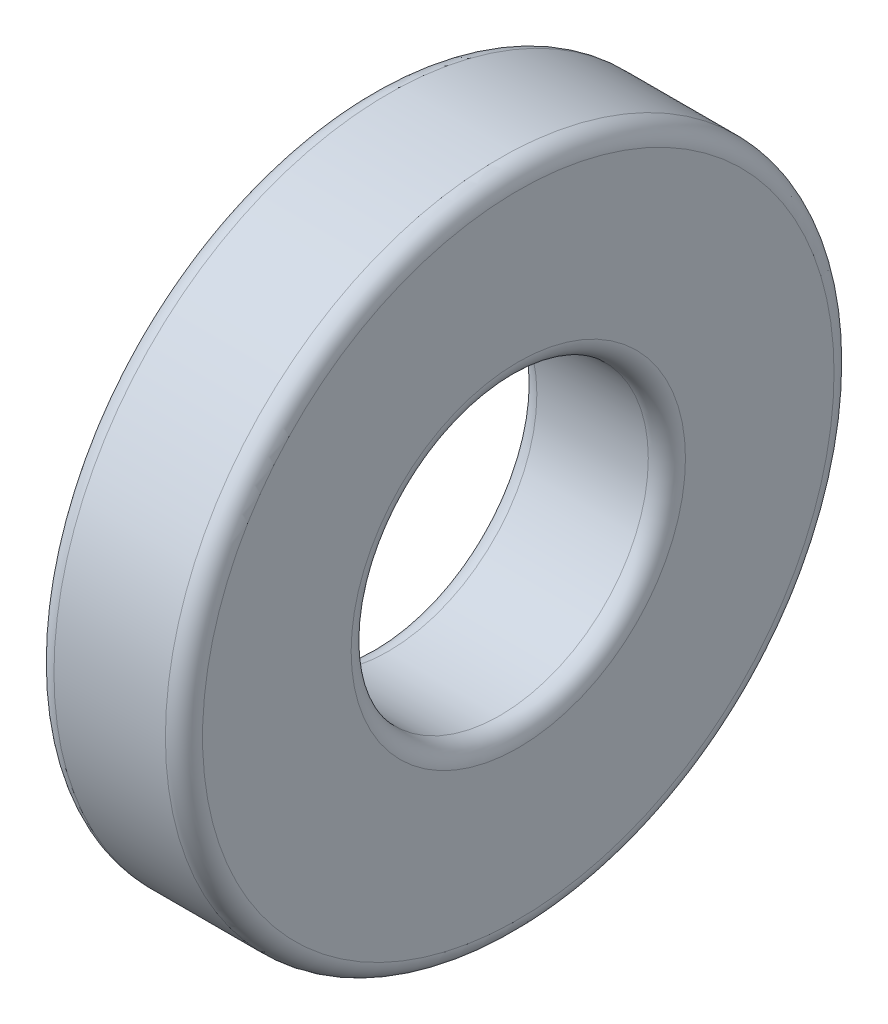
ISO-10303-21;
HEADER;
FILE_DESCRIPTION(('STEP AP214'),'2;1');
FILE_NAME('part.step','',(''),(''),'','','');
FILE_SCHEMA(('AUTOMOTIVE_DESIGN { 1 0 10303 214 1 1 1 1 }'));
ENDSEC;
DATA;
#1=APPLICATION_CONTEXT('core data for automotive mechanical design processes');
#2=APPLICATION_PROTOCOL_DEFINITION('international standard','automotive_design',2000,#1);
#3=PRODUCT_CONTEXT('',#1,'mechanical');
#4=PRODUCT('Part','Part','',(#3));
#5=PRODUCT_RELATED_PRODUCT_CATEGORY('part','',(#4));
#6=PRODUCT_DEFINITION_FORMATION('','',#4);
#7=PRODUCT_DEFINITION_CONTEXT('part definition',#1,'design');
#8=PRODUCT_DEFINITION('design','',#6,#7);
#9=PRODUCT_DEFINITION_SHAPE('','',#8);
#10=(LENGTH_UNIT() NAMED_UNIT(*) SI_UNIT(.MILLI.,.METRE.));
#11=(NAMED_UNIT(*) PLANE_ANGLE_UNIT() SI_UNIT($,.RADIAN.));
#12=(NAMED_UNIT(*) SI_UNIT($,.STERADIAN.) SOLID_ANGLE_UNIT());
#13=UNCERTAINTY_MEASURE_WITH_UNIT(LENGTH_MEASURE(1.E-05),#10,'distance_accuracy_value','');
#14=(GEOMETRIC_REPRESENTATION_CONTEXT(3) GLOBAL_UNCERTAINTY_ASSIGNED_CONTEXT((#13)) GLOBAL_UNIT_ASSIGNED_CONTEXT((#10,
#11,#12)) REPRESENTATION_CONTEXT('',''));
#15=CARTESIAN_POINT('',(0.,0.,0.));
#16=DIRECTION('',(0.,0.,1.));
#17=DIRECTION('',(1.,0.,0.));
#18=AXIS2_PLACEMENT_3D('',#15,#16,#17);
#19=CARTESIAN_POINT('',(-3.175,14.2875,0.));
#20=DIRECTION('',(-1.,0.,0.));
#21=DIRECTION('',(0.,0.,1.));
#22=AXIS2_PLACEMENT_3D('',#19,#20,#21);
#23=PLANE('',#22);
#24=CARTESIAN_POINT('',(-3.175,0.,0.));
#25=DIRECTION('',(-1.,0.,0.));
#26=DIRECTION('',(0.,0.,1.));
#27=AXIS2_PLACEMENT_3D('',#24,#25,#26);
#28=CIRCLE('',#27,7.14375);
#29=CARTESIAN_POINT('',(-3.175,0.,7.14375));
#30=VERTEX_POINT('',#29);
#31=EDGE_CURVE('E58',#30,#30,#28,.F.);
#32=ORIENTED_EDGE('',*,*,#31,.T.);
#33=EDGE_LOOP('',(#32));
#34=FACE_BOUND('',#33,.T.);
#35=CARTESIAN_POINT('',(-3.175,0.,0.));
#36=DIRECTION('',(-1.,0.,0.));
#37=DIRECTION('',(0.,0.,1.));
#38=AXIS2_PLACEMENT_3D('',#35,#36,#37);
#39=CIRCLE('',#38,13.49375);
#40=CARTESIAN_POINT('',(-3.175,0.,13.49375));
#41=VERTEX_POINT('',#40);
#42=EDGE_CURVE('E61',#41,#41,#39,.T.);
#43=ORIENTED_EDGE('',*,*,#42,.T.);
#44=EDGE_LOOP('',(#43));
#45=FACE_BOUND('',#44,.T.);
#46=ADVANCED_FACE('F32',(#34,#45),#23,.T.);
#47=CARTESIAN_POINT('',(0.,0.,0.));
#48=DIRECTION('',(1.,0.,0.));
#49=DIRECTION('',(0.,0.,-1.));
#50=AXIS2_PLACEMENT_3D('',#47,#48,#49);
#51=CYLINDRICAL_SURFACE('',#50,6.35);
#52=CARTESIAN_POINT('',(-2.38125,0.,0.));
#53=DIRECTION('',(-1.,0.,0.));
#54=DIRECTION('',(0.,0.,1.));
#55=AXIS2_PLACEMENT_3D('',#52,#53,#54);
#56=CIRCLE('',#55,6.35);
#57=CARTESIAN_POINT('',(-2.38125,0.,6.35));
#58=VERTEX_POINT('',#57);
#59=EDGE_CURVE('E52',#58,#58,#56,.T.);
#60=ORIENTED_EDGE('',*,*,#59,.T.);
#61=EDGE_LOOP('',(#60));
#62=FACE_BOUND('',#61,.T.);
#63=CARTESIAN_POINT('',(2.38125,0.,0.));
#64=DIRECTION('',(1.,0.,0.));
#65=DIRECTION('',(0.,0.,-1.));
#66=AXIS2_PLACEMENT_3D('',#63,#64,#65);
#67=CIRCLE('',#66,6.35);
#68=CARTESIAN_POINT('',(2.38125,0.,-6.35));
#69=VERTEX_POINT('',#68);
#70=EDGE_CURVE('E55',#69,#69,#67,.T.);
#71=ORIENTED_EDGE('',*,*,#70,.T.);
#72=EDGE_LOOP('',(#71));
#73=FACE_BOUND('',#72,.T.);
#74=ADVANCED_FACE('F88',(#62,#73),#51,.F.);
#75=CARTESIAN_POINT('',(3.175,14.2875,0.));
#76=DIRECTION('',(1.,0.,0.));
#77=DIRECTION('',(0.,0.,-1.));
#78=AXIS2_PLACEMENT_3D('',#75,#76,#77);
#79=PLANE('',#78);
#80=CARTESIAN_POINT('',(3.175,0.,0.));
#81=DIRECTION('',(1.,0.,0.));
#82=DIRECTION('',(0.,0.,-1.));
#83=AXIS2_PLACEMENT_3D('',#80,#81,#82);
#84=CIRCLE('',#83,7.14375);
#85=CARTESIAN_POINT('',(3.175,0.,-7.14375));
#86=VERTEX_POINT('',#85);
#87=EDGE_CURVE('E10',#86,#86,#84,.F.);
#88=ORIENTED_EDGE('',*,*,#87,.T.);
#89=EDGE_LOOP('',(#88));
#90=FACE_BOUND('',#89,.T.);
#91=CARTESIAN_POINT('',(3.175,0.,0.));
#92=DIRECTION('',(1.,0.,0.));
#93=DIRECTION('',(0.,0.,-1.));
#94=AXIS2_PLACEMENT_3D('',#91,#92,#93);
#95=CIRCLE('',#94,13.49375);
#96=CARTESIAN_POINT('',(3.175,0.,-13.49375));
#97=VERTEX_POINT('',#96);
#98=EDGE_CURVE('E39',#97,#97,#95,.T.);
#99=ORIENTED_EDGE('',*,*,#98,.T.);
#100=EDGE_LOOP('',(#99));
#101=FACE_BOUND('',#100,.T.);
#102=ADVANCED_FACE('F77',(#90,#101),#79,.T.);
#103=CARTESIAN_POINT('',(0.,0.,0.));
#104=DIRECTION('',(1.,0.,0.));
#105=DIRECTION('',(0.,0.,-1.));
#106=AXIS2_PLACEMENT_3D('',#103,#104,#105);
#107=CYLINDRICAL_SURFACE('',#106,14.2875);
#108=CARTESIAN_POINT('',(-2.38125,0.,0.));
#109=DIRECTION('',(-1.,0.,0.));
#110=DIRECTION('',(0.,0.,1.));
#111=AXIS2_PLACEMENT_3D('',#108,#109,#110);
#112=CIRCLE('',#111,14.2875);
#113=CARTESIAN_POINT('',(-2.38125,0.,14.2875));
#114=VERTEX_POINT('',#113);
#115=EDGE_CURVE('E43',#114,#114,#112,.F.);
#116=ORIENTED_EDGE('',*,*,#115,.T.);
#117=EDGE_LOOP('',(#116));
#118=FACE_BOUND('',#117,.T.);
#119=CARTESIAN_POINT('',(2.38125,0.,0.));
#120=DIRECTION('',(1.,0.,0.));
#121=DIRECTION('',(0.,0.,-1.));
#122=AXIS2_PLACEMENT_3D('',#119,#120,#121);
#123=CIRCLE('',#122,14.2875);
#124=CARTESIAN_POINT('',(2.38125,0.,-14.2875));
#125=VERTEX_POINT('',#124);
#126=EDGE_CURVE('E47',#125,#125,#123,.F.);
#127=ORIENTED_EDGE('',*,*,#126,.T.);
#128=EDGE_LOOP('',(#127));
#129=FACE_BOUND('',#128,.T.);
#130=ADVANCED_FACE('F74',(#118,#129),#107,.T.);
#131=CARTESIAN_POINT('',(-2.38125,0.,0.));
#132=DIRECTION('',(-1.,0.,0.));
#133=DIRECTION('',(0.,0.,1.));
#134=AXIS2_PLACEMENT_3D('',#131,#132,#133);
#135=TOROIDAL_SURFACE('',#134,7.14375,0.79375);
#136=ORIENTED_EDGE('',*,*,#59,.F.);
#137=EDGE_LOOP('',(#136));
#138=FACE_BOUND('',#137,.T.);
#139=ORIENTED_EDGE('',*,*,#31,.F.);
#140=EDGE_LOOP('',(#139));
#141=FACE_BOUND('',#140,.T.);
#142=ADVANCED_FACE('F70',(#138,#141),#135,.T.);
#143=CARTESIAN_POINT('',(-2.38125,0.,0.));
#144=DIRECTION('',(-1.,0.,0.));
#145=DIRECTION('',(0.,0.,1.));
#146=AXIS2_PLACEMENT_3D('',#143,#144,#145);
#147=TOROIDAL_SURFACE('',#146,13.49375,0.79375);
#148=ORIENTED_EDGE('',*,*,#42,.F.);
#149=EDGE_LOOP('',(#148));
#150=FACE_BOUND('',#149,.T.);
#151=ORIENTED_EDGE('',*,*,#115,.F.);
#152=EDGE_LOOP('',(#151));
#153=FACE_BOUND('',#152,.T.);
#154=ADVANCED_FACE('F66',(#150,#153),#147,.T.);
#155=CARTESIAN_POINT('',(2.38125,0.,0.));
#156=DIRECTION('',(1.,0.,0.));
#157=DIRECTION('',(0.,0.,-1.));
#158=AXIS2_PLACEMENT_3D('',#155,#156,#157);
#159=TOROIDAL_SURFACE('',#158,7.14375,0.79375);
#160=ORIENTED_EDGE('',*,*,#87,.F.);
#161=EDGE_LOOP('',(#160));
#162=FACE_BOUND('',#161,.T.);
#163=ORIENTED_EDGE('',*,*,#70,.F.);
#164=EDGE_LOOP('',(#163));
#165=FACE_BOUND('',#164,.T.);
#166=ADVANCED_FACE('F69',(#162,#165),#159,.T.);
#167=CARTESIAN_POINT('',(2.38125,0.,0.));
#168=DIRECTION('',(1.,0.,0.));
#169=DIRECTION('',(0.,0.,-1.));
#170=AXIS2_PLACEMENT_3D('',#167,#168,#169);
#171=TOROIDAL_SURFACE('',#170,13.49375,0.79375);
#172=ORIENTED_EDGE('',*,*,#126,.F.);
#173=EDGE_LOOP('',(#172));
#174=FACE_BOUND('',#173,.T.);
#175=ORIENTED_EDGE('',*,*,#98,.F.);
#176=EDGE_LOOP('',(#175));
#177=FACE_BOUND('',#176,.T.);
#178=ADVANCED_FACE('F34',(#174,#177),#171,.T.);
#179=CLOSED_SHELL('',(#46,#74,#102,#130,#142,#154,#166,#178));
#180=MANIFOLD_SOLID_BREP('B2',#179);
#181=ADVANCED_BREP_SHAPE_REPRESENTATION('',(#18,#180),#14);
#182=SHAPE_DEFINITION_REPRESENTATION(#9,#181);
ENDSEC;
END-ISO-10303-21;
